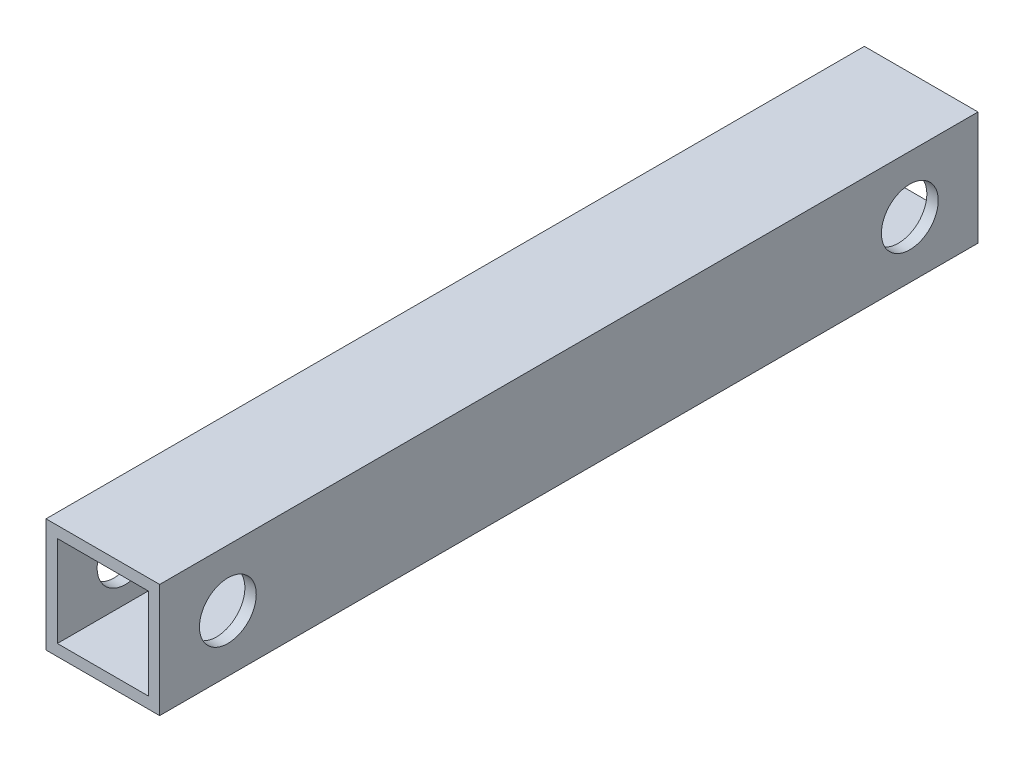
ISO-10303-21;
HEADER;
FILE_DESCRIPTION(('STEP AP214'),'2;1');
FILE_NAME('part.step','',(''),(''),'','','');
FILE_SCHEMA(('AUTOMOTIVE_DESIGN { 1 0 10303 214 1 1 1 1 }'));
ENDSEC;
DATA;
#1=APPLICATION_CONTEXT('core data for automotive mechanical design processes');
#2=APPLICATION_PROTOCOL_DEFINITION('international standard','automotive_design',2000,#1);
#3=PRODUCT_CONTEXT('',#1,'mechanical');
#4=PRODUCT('Part','Part','',(#3));
#5=PRODUCT_RELATED_PRODUCT_CATEGORY('part','',(#4));
#6=PRODUCT_DEFINITION_FORMATION('','',#4);
#7=PRODUCT_DEFINITION_CONTEXT('part definition',#1,'design');
#8=PRODUCT_DEFINITION('design','',#6,#7);
#9=PRODUCT_DEFINITION_SHAPE('','',#8);
#10=(LENGTH_UNIT() NAMED_UNIT(*) SI_UNIT(.MILLI.,.METRE.));
#11=(NAMED_UNIT(*) PLANE_ANGLE_UNIT() SI_UNIT($,.RADIAN.));
#12=(NAMED_UNIT(*) SI_UNIT($,.STERADIAN.) SOLID_ANGLE_UNIT());
#13=UNCERTAINTY_MEASURE_WITH_UNIT(LENGTH_MEASURE(1.E-05),#10,'distance_accuracy_value','');
#14=(GEOMETRIC_REPRESENTATION_CONTEXT(3) GLOBAL_UNCERTAINTY_ASSIGNED_CONTEXT((#13)) GLOBAL_UNIT_ASSIGNED_CONTEXT((#10,
#11,#12)) REPRESENTATION_CONTEXT('',''));
#15=CARTESIAN_POINT('',(0.,0.,0.));
#16=DIRECTION('',(0.,0.,1.));
#17=DIRECTION('',(1.,0.,0.));
#18=AXIS2_PLACEMENT_3D('',#15,#16,#17);
#19=CARTESIAN_POINT('',(0.,0.,360.));
#20=DIRECTION('',(0.,0.,-1.));
#21=DIRECTION('',(-1.,0.,0.));
#22=AXIS2_PLACEMENT_3D('',#19,#20,#21);
#23=PLANE('',#22);
#24=DIRECTION('',(0.,1.,0.));
#25=VECTOR('',#24,1.);
#26=CARTESIAN_POINT('',(25.,-25.,360.));
#27=LINE('',#26,#25);
#28=CARTESIAN_POINT('',(25.,-25.,360.));
#29=VERTEX_POINT('',#28);
#30=CARTESIAN_POINT('',(25.,25.,360.));
#31=VERTEX_POINT('',#30);
#32=EDGE_CURVE('E139',#29,#31,#27,.T.);
#33=ORIENTED_EDGE('',*,*,#32,.T.);
#34=DIRECTION('',(-1.,0.,0.));
#35=VECTOR('',#34,1.);
#36=CARTESIAN_POINT('',(-25.,25.,360.));
#37=LINE('',#36,#35);
#38=CARTESIAN_POINT('',(-25.,25.,360.));
#39=VERTEX_POINT('',#38);
#40=EDGE_CURVE('E142',#31,#39,#37,.T.);
#41=ORIENTED_EDGE('',*,*,#40,.T.);
#42=DIRECTION('',(0.,-1.,0.));
#43=VECTOR('',#42,1.);
#44=CARTESIAN_POINT('',(-25.,-25.,360.));
#45=LINE('',#44,#43);
#46=CARTESIAN_POINT('',(-25.,-25.,360.));
#47=VERTEX_POINT('',#46);
#48=EDGE_CURVE('E145',#39,#47,#45,.T.);
#49=ORIENTED_EDGE('',*,*,#48,.T.);
#50=DIRECTION('',(1.,0.,0.));
#51=VECTOR('',#50,1.);
#52=CARTESIAN_POINT('',(-25.,-25.,360.));
#53=LINE('',#52,#51);
#54=EDGE_CURVE('E147',#47,#29,#53,.T.);
#55=ORIENTED_EDGE('',*,*,#54,.T.);
#56=EDGE_LOOP('',(#33,#41,#49,#55));
#57=FACE_BOUND('',#56,.T.);
#58=DIRECTION('',(0.,1.,0.));
#59=VECTOR('',#58,1.);
#60=CARTESIAN_POINT('',(20.,-20.,360.));
#61=LINE('',#60,#59);
#62=CARTESIAN_POINT('',(20.,-20.,360.));
#63=VERTEX_POINT('',#62);
#64=CARTESIAN_POINT('',(20.,20.,360.));
#65=VERTEX_POINT('',#64);
#66=EDGE_CURVE('E101',#63,#65,#61,.T.);
#67=ORIENTED_EDGE('',*,*,#66,.F.);
#68=DIRECTION('',(1.,0.,0.));
#69=VECTOR('',#68,1.);
#70=CARTESIAN_POINT('',(-20.,-20.,360.));
#71=LINE('',#70,#69);
#72=CARTESIAN_POINT('',(-20.,-20.,360.));
#73=VERTEX_POINT('',#72);
#74=EDGE_CURVE('E123',#73,#63,#71,.T.);
#75=ORIENTED_EDGE('',*,*,#74,.F.);
#76=DIRECTION('',(0.,-1.,0.));
#77=VECTOR('',#76,1.);
#78=CARTESIAN_POINT('',(-20.,-20.,360.));
#79=LINE('',#78,#77);
#80=CARTESIAN_POINT('',(-20.,20.,360.));
#81=VERTEX_POINT('',#80);
#82=EDGE_CURVE('E121',#81,#73,#79,.T.);
#83=ORIENTED_EDGE('',*,*,#82,.F.);
#84=DIRECTION('',(-1.,0.,0.));
#85=VECTOR('',#84,1.);
#86=CARTESIAN_POINT('',(-20.,20.,360.));
#87=LINE('',#86,#85);
#88=EDGE_CURVE('E109',#65,#81,#87,.T.);
#89=ORIENTED_EDGE('',*,*,#88,.F.);
#90=EDGE_LOOP('',(#67,#75,#83,#89));
#91=FACE_BOUND('',#90,.T.);
#92=ADVANCED_FACE('F34',(#57,#91),#23,.F.);
#93=CARTESIAN_POINT('',(0.,0.,0.));
#94=DIRECTION('',(0.,0.,-1.));
#95=DIRECTION('',(-1.,0.,0.));
#96=AXIS2_PLACEMENT_3D('',#93,#94,#95);
#97=PLANE('',#96);
#98=DIRECTION('',(0.,1.,0.));
#99=VECTOR('',#98,1.);
#100=CARTESIAN_POINT('',(25.,-25.,0.));
#101=LINE('',#100,#99);
#102=CARTESIAN_POINT('',(25.,-25.,0.));
#103=VERTEX_POINT('',#102);
#104=CARTESIAN_POINT('',(25.,25.,0.));
#105=VERTEX_POINT('',#104);
#106=EDGE_CURVE('E117',#103,#105,#101,.T.);
#107=ORIENTED_EDGE('',*,*,#106,.F.);
#108=DIRECTION('',(1.,0.,0.));
#109=VECTOR('',#108,1.);
#110=CARTESIAN_POINT('',(-25.,-25.,0.));
#111=LINE('',#110,#109);
#112=CARTESIAN_POINT('',(-25.,-25.,0.));
#113=VERTEX_POINT('',#112);
#114=EDGE_CURVE('E143',#113,#103,#111,.T.);
#115=ORIENTED_EDGE('',*,*,#114,.F.);
#116=DIRECTION('',(0.,-1.,0.));
#117=VECTOR('',#116,1.);
#118=CARTESIAN_POINT('',(-25.,-25.,0.));
#119=LINE('',#118,#117);
#120=CARTESIAN_POINT('',(-25.,25.,0.));
#121=VERTEX_POINT('',#120);
#122=EDGE_CURVE('E154',#121,#113,#119,.T.);
#123=ORIENTED_EDGE('',*,*,#122,.F.);
#124=DIRECTION('',(-1.,0.,0.));
#125=VECTOR('',#124,1.);
#126=CARTESIAN_POINT('',(-25.,25.,0.));
#127=LINE('',#126,#125);
#128=EDGE_CURVE('E152',#105,#121,#127,.T.);
#129=ORIENTED_EDGE('',*,*,#128,.F.);
#130=EDGE_LOOP('',(#107,#115,#123,#129));
#131=FACE_BOUND('',#130,.T.);
#132=DIRECTION('',(1.,0.,0.));
#133=VECTOR('',#132,1.);
#134=CARTESIAN_POINT('',(-20.,-20.,0.));
#135=LINE('',#134,#133);
#136=CARTESIAN_POINT('',(-20.,-20.,0.));
#137=VERTEX_POINT('',#136);
#138=CARTESIAN_POINT('',(20.,-20.,0.));
#139=VERTEX_POINT('',#138);
#140=EDGE_CURVE('E110',#137,#139,#135,.T.);
#141=ORIENTED_EDGE('',*,*,#140,.T.);
#142=DIRECTION('',(0.,1.,0.));
#143=VECTOR('',#142,1.);
#144=CARTESIAN_POINT('',(20.,-20.,0.));
#145=LINE('',#144,#143);
#146=CARTESIAN_POINT('',(20.,20.,0.));
#147=VERTEX_POINT('',#146);
#148=EDGE_CURVE('E59',#139,#147,#145,.T.);
#149=ORIENTED_EDGE('',*,*,#148,.T.);
#150=DIRECTION('',(-1.,0.,0.));
#151=VECTOR('',#150,1.);
#152=CARTESIAN_POINT('',(-20.,20.,0.));
#153=LINE('',#152,#151);
#154=CARTESIAN_POINT('',(-20.,20.,0.));
#155=VERTEX_POINT('',#154);
#156=EDGE_CURVE('E116',#147,#155,#153,.T.);
#157=ORIENTED_EDGE('',*,*,#156,.T.);
#158=DIRECTION('',(0.,-1.,0.));
#159=VECTOR('',#158,1.);
#160=CARTESIAN_POINT('',(-20.,-20.,0.));
#161=LINE('',#160,#159);
#162=EDGE_CURVE('E131',#155,#137,#161,.T.);
#163=ORIENTED_EDGE('',*,*,#162,.T.);
#164=EDGE_LOOP('',(#141,#149,#157,#163));
#165=FACE_BOUND('',#164,.T.);
#166=ADVANCED_FACE('F208',(#131,#165),#97,.T.);
#167=CARTESIAN_POINT('',(25.,-25.,360.));
#168=DIRECTION('',(-1.,0.,0.));
#169=DIRECTION('',(0.,0.,1.));
#170=AXIS2_PLACEMENT_3D('',#167,#168,#169);
#171=PLANE('',#170);
#172=CARTESIAN_POINT('',(25.,0.,330.));
#173=DIRECTION('',(1.,0.,0.));
#174=DIRECTION('',(0.,0.,-1.));
#175=AXIS2_PLACEMENT_3D('',#172,#173,#174);
#176=CIRCLE('',#175,12.5);
#177=CARTESIAN_POINT('',(25.,0.,317.5));
#178=VERTEX_POINT('',#177);
#179=EDGE_CURVE('E166',#178,#178,#176,.T.);
#180=ORIENTED_EDGE('',*,*,#179,.F.);
#181=EDGE_LOOP('',(#180));
#182=FACE_BOUND('',#181,.T.);
#183=CARTESIAN_POINT('',(25.,0.,30.));
#184=DIRECTION('',(1.,0.,0.));
#185=DIRECTION('',(0.,0.,-1.));
#186=AXIS2_PLACEMENT_3D('',#183,#184,#185);
#187=CIRCLE('',#186,12.5);
#188=CARTESIAN_POINT('',(25.,0.,17.5));
#189=VERTEX_POINT('',#188);
#190=EDGE_CURVE('E173',#189,#189,#187,.T.);
#191=ORIENTED_EDGE('',*,*,#190,.F.);
#192=EDGE_LOOP('',(#191));
#193=FACE_BOUND('',#192,.T.);
#194=ORIENTED_EDGE('',*,*,#106,.T.);
#195=DIRECTION('',(0.,0.,-1.));
#196=VECTOR('',#195,1.);
#197=CARTESIAN_POINT('',(25.,25.,360.));
#198=LINE('',#197,#196);
#199=EDGE_CURVE('E11',#31,#105,#198,.T.);
#200=ORIENTED_EDGE('',*,*,#199,.F.);
#201=ORIENTED_EDGE('',*,*,#32,.F.);
#202=DIRECTION('',(0.,0.,-1.));
#203=VECTOR('',#202,1.);
#204=CARTESIAN_POINT('',(25.,-25.,360.));
#205=LINE('',#204,#203);
#206=EDGE_CURVE('E149',#29,#103,#205,.T.);
#207=ORIENTED_EDGE('',*,*,#206,.T.);
#208=EDGE_LOOP('',(#194,#200,#201,#207));
#209=FACE_BOUND('',#208,.T.);
#210=ADVANCED_FACE('F36',(#182,#193,#209),#171,.F.);
#211=CARTESIAN_POINT('',(-25.,25.,360.));
#212=DIRECTION('',(0.,-1.,0.));
#213=DIRECTION('',(0.,0.,-1.));
#214=AXIS2_PLACEMENT_3D('',#211,#212,#213);
#215=PLANE('',#214);
#216=ORIENTED_EDGE('',*,*,#128,.T.);
#217=DIRECTION('',(0.,0.,-1.));
#218=VECTOR('',#217,1.);
#219=CARTESIAN_POINT('',(-25.,25.,360.));
#220=LINE('',#219,#218);
#221=EDGE_CURVE('E43',#39,#121,#220,.T.);
#222=ORIENTED_EDGE('',*,*,#221,.F.);
#223=ORIENTED_EDGE('',*,*,#40,.F.);
#224=ORIENTED_EDGE('',*,*,#199,.T.);
#225=EDGE_LOOP('',(#216,#222,#223,#224));
#226=FACE_BOUND('',#225,.T.);
#227=ADVANCED_FACE('F224',(#226),#215,.F.);
#228=CARTESIAN_POINT('',(-25.,-25.,360.));
#229=DIRECTION('',(1.,0.,0.));
#230=DIRECTION('',(0.,0.,-1.));
#231=AXIS2_PLACEMENT_3D('',#228,#229,#230);
#232=PLANE('',#231);
#233=CARTESIAN_POINT('',(-25.,0.,330.));
#234=DIRECTION('',(1.,0.,0.));
#235=DIRECTION('',(0.,0.,-1.));
#236=AXIS2_PLACEMENT_3D('',#233,#234,#235);
#237=CIRCLE('',#236,12.5);
#238=CARTESIAN_POINT('',(-25.,0.,317.5));
#239=VERTEX_POINT('',#238);
#240=EDGE_CURVE('E129',#239,#239,#237,.T.);
#241=ORIENTED_EDGE('',*,*,#240,.T.);
#242=EDGE_LOOP('',(#241));
#243=FACE_BOUND('',#242,.T.);
#244=CARTESIAN_POINT('',(-25.,0.,30.));
#245=DIRECTION('',(1.,0.,0.));
#246=DIRECTION('',(0.,0.,-1.));
#247=AXIS2_PLACEMENT_3D('',#244,#245,#246);
#248=CIRCLE('',#247,12.5);
#249=CARTESIAN_POINT('',(-25.,0.,17.5));
#250=VERTEX_POINT('',#249);
#251=EDGE_CURVE('E170',#250,#250,#248,.T.);
#252=ORIENTED_EDGE('',*,*,#251,.T.);
#253=EDGE_LOOP('',(#252));
#254=FACE_BOUND('',#253,.T.);
#255=ORIENTED_EDGE('',*,*,#122,.T.);
#256=DIRECTION('',(0.,0.,-1.));
#257=VECTOR('',#256,1.);
#258=CARTESIAN_POINT('',(-25.,-25.,360.));
#259=LINE('',#258,#257);
#260=EDGE_CURVE('E159',#47,#113,#259,.T.);
#261=ORIENTED_EDGE('',*,*,#260,.F.);
#262=ORIENTED_EDGE('',*,*,#48,.F.);
#263=ORIENTED_EDGE('',*,*,#221,.T.);
#264=EDGE_LOOP('',(#255,#261,#262,#263));
#265=FACE_BOUND('',#264,.T.);
#266=ADVANCED_FACE('F187',(#243,#254,#265),#232,.F.);
#267=CARTESIAN_POINT('',(-25.,-25.,360.));
#268=DIRECTION('',(0.,1.,0.));
#269=DIRECTION('',(0.,0.,1.));
#270=AXIS2_PLACEMENT_3D('',#267,#268,#269);
#271=PLANE('',#270);
#272=ORIENTED_EDGE('',*,*,#114,.T.);
#273=ORIENTED_EDGE('',*,*,#206,.F.);
#274=ORIENTED_EDGE('',*,*,#54,.F.);
#275=ORIENTED_EDGE('',*,*,#260,.T.);
#276=EDGE_LOOP('',(#272,#273,#274,#275));
#277=FACE_BOUND('',#276,.T.);
#278=ADVANCED_FACE('F219',(#277),#271,.F.);
#279=CARTESIAN_POINT('',(20.,-20.,360.));
#280=DIRECTION('',(-1.,0.,0.));
#281=DIRECTION('',(0.,0.,1.));
#282=AXIS2_PLACEMENT_3D('',#279,#280,#281);
#283=PLANE('',#282);
#284=CARTESIAN_POINT('',(20.,0.,330.));
#285=DIRECTION('',(-1.,0.,0.));
#286=DIRECTION('',(0.,0.,1.));
#287=AXIS2_PLACEMENT_3D('',#284,#285,#286);
#288=CIRCLE('',#287,12.5);
#289=CARTESIAN_POINT('',(20.,0.,342.5));
#290=VERTEX_POINT('',#289);
#291=EDGE_CURVE('E182',#290,#290,#288,.T.);
#292=ORIENTED_EDGE('',*,*,#291,.F.);
#293=EDGE_LOOP('',(#292));
#294=FACE_BOUND('',#293,.T.);
#295=CARTESIAN_POINT('',(20.,0.,30.));
#296=DIRECTION('',(-1.,0.,0.));
#297=DIRECTION('',(0.,0.,1.));
#298=AXIS2_PLACEMENT_3D('',#295,#296,#297);
#299=CIRCLE('',#298,12.5);
#300=CARTESIAN_POINT('',(20.,0.,42.5));
#301=VERTEX_POINT('',#300);
#302=EDGE_CURVE('E165',#301,#301,#299,.T.);
#303=ORIENTED_EDGE('',*,*,#302,.F.);
#304=EDGE_LOOP('',(#303));
#305=FACE_BOUND('',#304,.T.);
#306=ORIENTED_EDGE('',*,*,#148,.F.);
#307=DIRECTION('',(0.,0.,-1.));
#308=VECTOR('',#307,1.);
#309=CARTESIAN_POINT('',(20.,-20.,360.));
#310=LINE('',#309,#308);
#311=EDGE_CURVE('E105',#63,#139,#310,.T.);
#312=ORIENTED_EDGE('',*,*,#311,.F.);
#313=ORIENTED_EDGE('',*,*,#66,.T.);
#314=DIRECTION('',(0.,0.,-1.));
#315=VECTOR('',#314,1.);
#316=CARTESIAN_POINT('',(20.,20.,360.));
#317=LINE('',#316,#315);
#318=EDGE_CURVE('E104',#65,#147,#317,.T.);
#319=ORIENTED_EDGE('',*,*,#318,.T.);
#320=EDGE_LOOP('',(#306,#312,#313,#319));
#321=FACE_BOUND('',#320,.T.);
#322=ADVANCED_FACE('F103',(#294,#305,#321),#283,.T.);
#323=CARTESIAN_POINT('',(-20.,20.,360.));
#324=DIRECTION('',(0.,-1.,0.));
#325=DIRECTION('',(0.,0.,-1.));
#326=AXIS2_PLACEMENT_3D('',#323,#324,#325);
#327=PLANE('',#326);
#328=ORIENTED_EDGE('',*,*,#156,.F.);
#329=ORIENTED_EDGE('',*,*,#318,.F.);
#330=ORIENTED_EDGE('',*,*,#88,.T.);
#331=DIRECTION('',(0.,0.,-1.));
#332=VECTOR('',#331,1.);
#333=CARTESIAN_POINT('',(-20.,20.,360.));
#334=LINE('',#333,#332);
#335=EDGE_CURVE('E118',#81,#155,#334,.T.);
#336=ORIENTED_EDGE('',*,*,#335,.T.);
#337=EDGE_LOOP('',(#328,#329,#330,#336));
#338=FACE_BOUND('',#337,.T.);
#339=ADVANCED_FACE('F113',(#338),#327,.T.);
#340=CARTESIAN_POINT('',(-20.,-20.,360.));
#341=DIRECTION('',(1.,0.,0.));
#342=DIRECTION('',(0.,0.,-1.));
#343=AXIS2_PLACEMENT_3D('',#340,#341,#342);
#344=PLANE('',#343);
#345=CARTESIAN_POINT('',(-20.,0.,330.));
#346=DIRECTION('',(1.,0.,0.));
#347=DIRECTION('',(0.,0.,-1.));
#348=AXIS2_PLACEMENT_3D('',#345,#346,#347);
#349=CIRCLE('',#348,12.5);
#350=CARTESIAN_POINT('',(-20.,0.,317.5));
#351=VERTEX_POINT('',#350);
#352=EDGE_CURVE('E38',#351,#351,#349,.T.);
#353=ORIENTED_EDGE('',*,*,#352,.F.);
#354=EDGE_LOOP('',(#353));
#355=FACE_BOUND('',#354,.T.);
#356=CARTESIAN_POINT('',(-20.,0.,30.));
#357=DIRECTION('',(1.,0.,0.));
#358=DIRECTION('',(0.,0.,-1.));
#359=AXIS2_PLACEMENT_3D('',#356,#357,#358);
#360=CIRCLE('',#359,12.5);
#361=CARTESIAN_POINT('',(-20.,0.,17.5));
#362=VERTEX_POINT('',#361);
#363=EDGE_CURVE('E163',#362,#362,#360,.T.);
#364=ORIENTED_EDGE('',*,*,#363,.F.);
#365=EDGE_LOOP('',(#364));
#366=FACE_BOUND('',#365,.T.);
#367=ORIENTED_EDGE('',*,*,#162,.F.);
#368=ORIENTED_EDGE('',*,*,#335,.F.);
#369=ORIENTED_EDGE('',*,*,#82,.T.);
#370=DIRECTION('',(0.,0.,-1.));
#371=VECTOR('',#370,1.);
#372=CARTESIAN_POINT('',(-20.,-20.,360.));
#373=LINE('',#372,#371);
#374=EDGE_CURVE('E51',#73,#137,#373,.T.);
#375=ORIENTED_EDGE('',*,*,#374,.T.);
#376=EDGE_LOOP('',(#367,#368,#369,#375));
#377=FACE_BOUND('',#376,.T.);
#378=ADVANCED_FACE('F246',(#355,#366,#377),#344,.T.);
#379=CARTESIAN_POINT('',(-20.,-20.,360.));
#380=DIRECTION('',(0.,1.,0.));
#381=DIRECTION('',(0.,0.,1.));
#382=AXIS2_PLACEMENT_3D('',#379,#380,#381);
#383=PLANE('',#382);
#384=ORIENTED_EDGE('',*,*,#140,.F.);
#385=ORIENTED_EDGE('',*,*,#374,.F.);
#386=ORIENTED_EDGE('',*,*,#74,.T.);
#387=ORIENTED_EDGE('',*,*,#311,.T.);
#388=EDGE_LOOP('',(#384,#385,#386,#387));
#389=FACE_BOUND('',#388,.T.);
#390=ADVANCED_FACE('F203',(#389),#383,.T.);
#391=CARTESIAN_POINT('',(-275.,0.,30.));
#392=DIRECTION('',(1.,0.,0.));
#393=DIRECTION('',(0.,0.,-1.));
#394=AXIS2_PLACEMENT_3D('',#391,#392,#393);
#395=CYLINDRICAL_SURFACE('',#394,12.5);
#396=ORIENTED_EDGE('',*,*,#363,.T.);
#397=EDGE_LOOP('',(#396));
#398=FACE_BOUND('',#397,.T.);
#399=ORIENTED_EDGE('',*,*,#251,.F.);
#400=EDGE_LOOP('',(#399));
#401=FACE_BOUND('',#400,.T.);
#402=ADVANCED_FACE('F193',(#398,#401),#395,.F.);
#403=CARTESIAN_POINT('',(-275.,0.,330.));
#404=DIRECTION('',(1.,0.,0.));
#405=DIRECTION('',(0.,0.,-1.));
#406=AXIS2_PLACEMENT_3D('',#403,#404,#405);
#407=CYLINDRICAL_SURFACE('',#406,12.5);
#408=ORIENTED_EDGE('',*,*,#352,.T.);
#409=EDGE_LOOP('',(#408));
#410=FACE_BOUND('',#409,.T.);
#411=ORIENTED_EDGE('',*,*,#240,.F.);
#412=EDGE_LOOP('',(#411));
#413=FACE_BOUND('',#412,.T.);
#414=ADVANCED_FACE('F190',(#410,#413),#407,.F.);
#415=ORIENTED_EDGE('',*,*,#302,.T.);
#416=EDGE_LOOP('',(#415));
#417=FACE_BOUND('',#416,.T.);
#418=ORIENTED_EDGE('',*,*,#190,.T.);
#419=EDGE_LOOP('',(#418));
#420=FACE_BOUND('',#419,.T.);
#421=ADVANCED_FACE('F192',(#417,#420),#395,.F.);
#422=ORIENTED_EDGE('',*,*,#291,.T.);
#423=EDGE_LOOP('',(#422));
#424=FACE_BOUND('',#423,.T.);
#425=ORIENTED_EDGE('',*,*,#179,.T.);
#426=EDGE_LOOP('',(#425));
#427=FACE_BOUND('',#426,.T.);
#428=ADVANCED_FACE('F196',(#424,#427),#407,.F.);
#429=CLOSED_SHELL('',(#92,#166,#210,#227,#266,#278,#322,#339,#378,#390,#402,#414,#421,#428));
#430=MANIFOLD_SOLID_BREP('B2',#429);
#431=ADVANCED_BREP_SHAPE_REPRESENTATION('',(#18,#430),#14);
#432=SHAPE_DEFINITION_REPRESENTATION(#9,#431);
ENDSEC;
END-ISO-10303-21;
